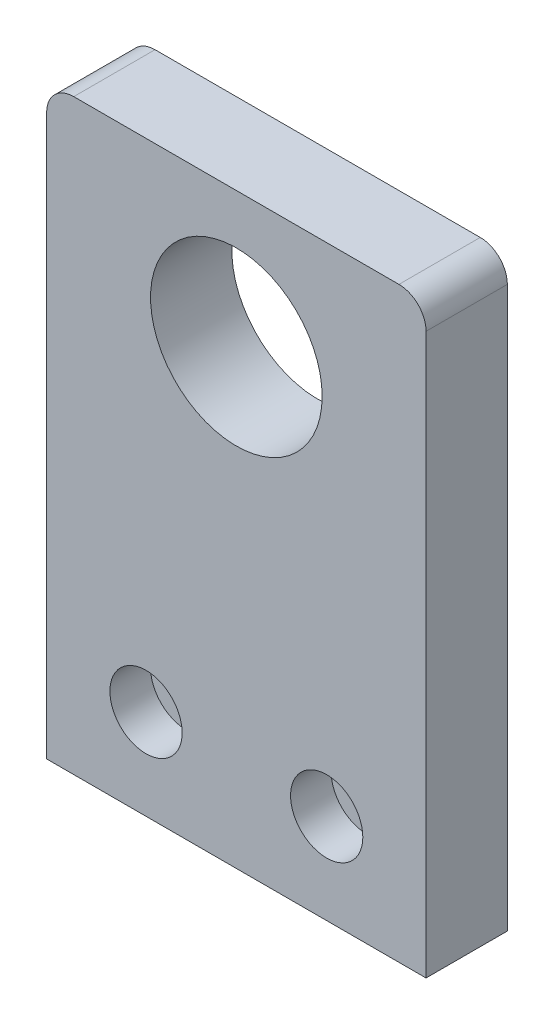
ISO-10303-21;
HEADER;
FILE_DESCRIPTION(('STEP AP214'),'2;1');
FILE_NAME('part.step','',(''),(''),'','','');
FILE_SCHEMA(('AUTOMOTIVE_DESIGN { 1 0 10303 214 1 1 1 1 }'));
ENDSEC;
DATA;
#1=APPLICATION_CONTEXT('core data for automotive mechanical design processes');
#2=APPLICATION_PROTOCOL_DEFINITION('international standard','automotive_design',2000,#1);
#3=PRODUCT_CONTEXT('',#1,'mechanical');
#4=PRODUCT('Part','Part','',(#3));
#5=PRODUCT_RELATED_PRODUCT_CATEGORY('part','',(#4));
#6=PRODUCT_DEFINITION_FORMATION('','',#4);
#7=PRODUCT_DEFINITION_CONTEXT('part definition',#1,'design');
#8=PRODUCT_DEFINITION('design','',#6,#7);
#9=PRODUCT_DEFINITION_SHAPE('','',#8);
#10=(LENGTH_UNIT() NAMED_UNIT(*) SI_UNIT(.MILLI.,.METRE.));
#11=(NAMED_UNIT(*) PLANE_ANGLE_UNIT() SI_UNIT($,.RADIAN.));
#12=(NAMED_UNIT(*) SI_UNIT($,.STERADIAN.) SOLID_ANGLE_UNIT());
#13=UNCERTAINTY_MEASURE_WITH_UNIT(LENGTH_MEASURE(1.E-05),#10,'distance_accuracy_value','');
#14=(GEOMETRIC_REPRESENTATION_CONTEXT(3) GLOBAL_UNCERTAINTY_ASSIGNED_CONTEXT((#13)) GLOBAL_UNIT_ASSIGNED_CONTEXT((#10,
#11,#12)) REPRESENTATION_CONTEXT('',''));
#15=CARTESIAN_POINT('',(0.,0.,0.));
#16=DIRECTION('',(0.,0.,1.));
#17=DIRECTION('',(1.,0.,0.));
#18=AXIS2_PLACEMENT_3D('',#15,#16,#17);
#19=CARTESIAN_POINT('',(10.,-22.5,9.));
#20=DIRECTION('',(0.,0.,-1.));
#21=DIRECTION('',(-1.,0.,0.));
#22=AXIS2_PLACEMENT_3D('',#19,#20,#21);
#23=CYLINDRICAL_SURFACE('',#22,2.);
#24=CARTESIAN_POINT('',(10.,-22.5,0.));
#25=DIRECTION('',(0.,0.,1.));
#26=DIRECTION('',(1.,0.,0.));
#27=AXIS2_PLACEMENT_3D('',#24,#25,#26);
#28=CIRCLE('',#27,2.);
#29=CARTESIAN_POINT('',(12.,-22.5,0.));
#30=VERTEX_POINT('',#29);
#31=EDGE_CURVE('E144',#30,#30,#28,.T.);
#32=ORIENTED_EDGE('',*,*,#31,.F.);
#33=EDGE_LOOP('',(#32));
#34=FACE_BOUND('',#33,.T.);
#35=CARTESIAN_POINT('',(10.,-22.5,4.5));
#36=DIRECTION('',(0.,0.,1.));
#37=DIRECTION('',(1.,0.,0.));
#38=AXIS2_PLACEMENT_3D('',#35,#36,#37);
#39=CIRCLE('',#38,2.);
#40=CARTESIAN_POINT('',(12.,-22.5,4.5));
#41=VERTEX_POINT('',#40);
#42=EDGE_CURVE('E37',#41,#41,#39,.T.);
#43=ORIENTED_EDGE('',*,*,#42,.T.);
#44=EDGE_LOOP('',(#43));
#45=FACE_BOUND('',#44,.T.);
#46=ADVANCED_FACE('F33',(#34,#45),#23,.F.);
#47=CARTESIAN_POINT('',(-9.99999999999999,-22.5,9.));
#48=DIRECTION('',(0.,0.,-1.));
#49=DIRECTION('',(-1.,0.,0.));
#50=AXIS2_PLACEMENT_3D('',#47,#48,#49);
#51=CYLINDRICAL_SURFACE('',#50,2.);
#52=CARTESIAN_POINT('',(-9.99999999999999,-22.5,0.));
#53=DIRECTION('',(0.,0.,1.));
#54=DIRECTION('',(1.,0.,0.));
#55=AXIS2_PLACEMENT_3D('',#52,#53,#54);
#56=CIRCLE('',#55,2.);
#57=CARTESIAN_POINT('',(-7.99999999999999,-22.5,0.));
#58=VERTEX_POINT('',#57);
#59=EDGE_CURVE('E139',#58,#58,#56,.T.);
#60=ORIENTED_EDGE('',*,*,#59,.F.);
#61=EDGE_LOOP('',(#60));
#62=FACE_BOUND('',#61,.T.);
#63=CARTESIAN_POINT('',(-9.99999999999999,-22.5,4.5));
#64=DIRECTION('',(0.,0.,1.));
#65=DIRECTION('',(1.,0.,0.));
#66=AXIS2_PLACEMENT_3D('',#63,#64,#65);
#67=CIRCLE('',#66,2.);
#68=CARTESIAN_POINT('',(-7.99999999999999,-22.5,4.5));
#69=VERTEX_POINT('',#68);
#70=EDGE_CURVE('E137',#69,#69,#67,.T.);
#71=ORIENTED_EDGE('',*,*,#70,.T.);
#72=EDGE_LOOP('',(#71));
#73=FACE_BOUND('',#72,.T.);
#74=ADVANCED_FACE('F190',(#62,#73),#51,.F.);
#75=CARTESIAN_POINT('',(-18.,29.5,9.));
#76=DIRECTION('',(0.,0.,1.));
#77=DIRECTION('',(1.,0.,0.));
#78=AXIS2_PLACEMENT_3D('',#75,#76,#77);
#79=PLANE('',#78);
#80=CARTESIAN_POINT('',(10.,-22.5,9.));
#81=DIRECTION('',(0.,0.,1.));
#82=DIRECTION('',(1.,0.,0.));
#83=AXIS2_PLACEMENT_3D('',#80,#81,#82);
#84=CIRCLE('',#83,4.);
#85=CARTESIAN_POINT('',(14.,-22.5,9.));
#86=VERTEX_POINT('',#85);
#87=EDGE_CURVE('E154',#86,#86,#84,.T.);
#88=ORIENTED_EDGE('',*,*,#87,.F.);
#89=EDGE_LOOP('',(#88));
#90=FACE_BOUND('',#89,.T.);
#91=CARTESIAN_POINT('',(-9.99999999999999,-22.5,9.));
#92=DIRECTION('',(0.,0.,1.));
#93=DIRECTION('',(1.,0.,0.));
#94=AXIS2_PLACEMENT_3D('',#91,#92,#93);
#95=CIRCLE('',#94,4.);
#96=CARTESIAN_POINT('',(-5.99999999999999,-22.5,9.));
#97=VERTEX_POINT('',#96);
#98=EDGE_CURVE('E147',#97,#97,#95,.T.);
#99=ORIENTED_EDGE('',*,*,#98,.F.);
#100=EDGE_LOOP('',(#99));
#101=FACE_BOUND('',#100,.T.);
#102=DIRECTION('',(0.,1.,0.));
#103=VECTOR('',#102,1.);
#104=CARTESIAN_POINT('',(21.,29.5,9.));
#105=LINE('',#104,#103);
#106=CARTESIAN_POINT('',(21.,-32.5,9.));
#107=VERTEX_POINT('',#106);
#108=CARTESIAN_POINT('',(21.,29.5,9.));
#109=VERTEX_POINT('',#108);
#110=EDGE_CURVE('E132',#107,#109,#105,.T.);
#111=ORIENTED_EDGE('',*,*,#110,.T.);
#112=CARTESIAN_POINT('',(18.,29.5,9.));
#113=DIRECTION('',(0.,0.,1.));
#114=DIRECTION('',(-1.,0.,0.));
#115=AXIS2_PLACEMENT_3D('',#112,#113,#114);
#116=CIRCLE('',#115,3.);
#117=CARTESIAN_POINT('',(18.,32.5,9.));
#118=VERTEX_POINT('',#117);
#119=EDGE_CURVE('E89',#109,#118,#116,.T.);
#120=ORIENTED_EDGE('',*,*,#119,.T.);
#121=DIRECTION('',(-1.,0.,0.));
#122=VECTOR('',#121,1.);
#123=CARTESIAN_POINT('',(-18.,32.5,9.));
#124=LINE('',#123,#122);
#125=CARTESIAN_POINT('',(-18.,32.5,9.));
#126=VERTEX_POINT('',#125);
#127=EDGE_CURVE('E103',#118,#126,#124,.T.);
#128=ORIENTED_EDGE('',*,*,#127,.T.);
#129=CARTESIAN_POINT('',(-18.,29.5,9.));
#130=DIRECTION('',(0.,0.,1.));
#131=DIRECTION('',(1.,0.,0.));
#132=AXIS2_PLACEMENT_3D('',#129,#130,#131);
#133=CIRCLE('',#132,3.);
#134=CARTESIAN_POINT('',(-21.,29.5,9.));
#135=VERTEX_POINT('',#134);
#136=EDGE_CURVE('E96',#126,#135,#133,.T.);
#137=ORIENTED_EDGE('',*,*,#136,.T.);
#138=DIRECTION('',(0.,-1.,0.));
#139=VECTOR('',#138,1.);
#140=CARTESIAN_POINT('',(-21.,29.5,9.));
#141=LINE('',#140,#139);
#142=CARTESIAN_POINT('',(-21.,-32.5,9.));
#143=VERTEX_POINT('',#142);
#144=EDGE_CURVE('E101',#135,#143,#141,.T.);
#145=ORIENTED_EDGE('',*,*,#144,.T.);
#146=DIRECTION('',(1.,0.,0.));
#147=VECTOR('',#146,1.);
#148=CARTESIAN_POINT('',(-21.,-32.5,9.));
#149=LINE('',#148,#147);
#150=EDGE_CURVE('E52',#143,#107,#149,.T.);
#151=ORIENTED_EDGE('',*,*,#150,.T.);
#152=EDGE_LOOP('',(#111,#120,#128,#137,#145,#151));
#153=FACE_BOUND('',#152,.T.);
#154=CARTESIAN_POINT('',(0.,17.5,9.));
#155=DIRECTION('',(0.,0.,1.));
#156=DIRECTION('',(1.,0.,0.));
#157=AXIS2_PLACEMENT_3D('',#154,#155,#156);
#158=CIRCLE('',#157,9.5);
#159=CARTESIAN_POINT('',(9.5,17.5,9.));
#160=VERTEX_POINT('',#159);
#161=EDGE_CURVE('E125',#160,#160,#158,.T.);
#162=ORIENTED_EDGE('',*,*,#161,.F.);
#163=EDGE_LOOP('',(#162));
#164=FACE_BOUND('',#163,.T.);
#165=ADVANCED_FACE('F98',(#90,#101,#153,#164),#79,.T.);
#166=CARTESIAN_POINT('',(-18.,29.5,0.));
#167=DIRECTION('',(0.,0.,1.));
#168=DIRECTION('',(1.,0.,0.));
#169=AXIS2_PLACEMENT_3D('',#166,#167,#168);
#170=PLANE('',#169);
#171=DIRECTION('',(0.,1.,0.));
#172=VECTOR('',#171,1.);
#173=CARTESIAN_POINT('',(21.,29.5,0.));
#174=LINE('',#173,#172);
#175=CARTESIAN_POINT('',(21.,-32.5,0.));
#176=VERTEX_POINT('',#175);
#177=CARTESIAN_POINT('',(21.,29.5,0.));
#178=VERTEX_POINT('',#177);
#179=EDGE_CURVE('E121',#176,#178,#174,.T.);
#180=ORIENTED_EDGE('',*,*,#179,.F.);
#181=DIRECTION('',(1.,0.,0.));
#182=VECTOR('',#181,1.);
#183=CARTESIAN_POINT('',(-21.,-32.5,0.));
#184=LINE('',#183,#182);
#185=CARTESIAN_POINT('',(-21.,-32.5,0.));
#186=VERTEX_POINT('',#185);
#187=EDGE_CURVE('E81',#186,#176,#184,.T.);
#188=ORIENTED_EDGE('',*,*,#187,.F.);
#189=DIRECTION('',(0.,-1.,0.));
#190=VECTOR('',#189,1.);
#191=CARTESIAN_POINT('',(-21.,29.5,0.));
#192=LINE('',#191,#190);
#193=CARTESIAN_POINT('',(-21.,29.5,0.));
#194=VERTEX_POINT('',#193);
#195=EDGE_CURVE('E75',#194,#186,#192,.T.);
#196=ORIENTED_EDGE('',*,*,#195,.F.);
#197=CARTESIAN_POINT('',(-18.,29.5,0.));
#198=DIRECTION('',(0.,0.,1.));
#199=DIRECTION('',(1.,0.,0.));
#200=AXIS2_PLACEMENT_3D('',#197,#198,#199);
#201=CIRCLE('',#200,3.);
#202=CARTESIAN_POINT('',(-18.,32.5,0.));
#203=VERTEX_POINT('',#202);
#204=EDGE_CURVE('E111',#203,#194,#201,.T.);
#205=ORIENTED_EDGE('',*,*,#204,.F.);
#206=DIRECTION('',(-1.,0.,0.));
#207=VECTOR('',#206,1.);
#208=CARTESIAN_POINT('',(-18.,32.5,0.));
#209=LINE('',#208,#207);
#210=CARTESIAN_POINT('',(18.,32.5,0.));
#211=VERTEX_POINT('',#210);
#212=EDGE_CURVE('E127',#211,#203,#209,.T.);
#213=ORIENTED_EDGE('',*,*,#212,.F.);
#214=CARTESIAN_POINT('',(18.,29.5,0.));
#215=DIRECTION('',(0.,0.,1.));
#216=DIRECTION('',(-1.,0.,0.));
#217=AXIS2_PLACEMENT_3D('',#214,#215,#216);
#218=CIRCLE('',#217,3.);
#219=EDGE_CURVE('E124',#178,#211,#218,.T.);
#220=ORIENTED_EDGE('',*,*,#219,.F.);
#221=EDGE_LOOP('',(#180,#188,#196,#205,#213,#220));
#222=FACE_BOUND('',#221,.T.);
#223=CARTESIAN_POINT('',(0.,17.5,0.));
#224=DIRECTION('',(0.,0.,1.));
#225=DIRECTION('',(1.,0.,0.));
#226=AXIS2_PLACEMENT_3D('',#223,#224,#225);
#227=CIRCLE('',#226,9.5);
#228=CARTESIAN_POINT('',(9.5,17.5,0.));
#229=VERTEX_POINT('',#228);
#230=EDGE_CURVE('E159',#229,#229,#227,.T.);
#231=ORIENTED_EDGE('',*,*,#230,.T.);
#232=EDGE_LOOP('',(#231));
#233=FACE_BOUND('',#232,.T.);
#234=ORIENTED_EDGE('',*,*,#31,.T.);
#235=EDGE_LOOP('',(#234));
#236=FACE_BOUND('',#235,.T.);
#237=ORIENTED_EDGE('',*,*,#59,.T.);
#238=EDGE_LOOP('',(#237));
#239=FACE_BOUND('',#238,.T.);
#240=ADVANCED_FACE('F173',(#222,#233,#236,#239),#170,.F.);
#241=CARTESIAN_POINT('',(21.,29.5,9.));
#242=DIRECTION('',(-1.,0.,0.));
#243=DIRECTION('',(0.,-1.,0.));
#244=AXIS2_PLACEMENT_3D('',#241,#242,#243);
#245=PLANE('',#244);
#246=ORIENTED_EDGE('',*,*,#179,.T.);
#247=DIRECTION('',(0.,0.,-1.));
#248=VECTOR('',#247,1.);
#249=CARTESIAN_POINT('',(21.,29.5,9.));
#250=LINE('',#249,#248);
#251=EDGE_CURVE('E11',#109,#178,#250,.T.);
#252=ORIENTED_EDGE('',*,*,#251,.F.);
#253=ORIENTED_EDGE('',*,*,#110,.F.);
#254=DIRECTION('',(0.,0.,-1.));
#255=VECTOR('',#254,1.);
#256=CARTESIAN_POINT('',(21.,-32.5,9.));
#257=LINE('',#256,#255);
#258=EDGE_CURVE('E117',#107,#176,#257,.T.);
#259=ORIENTED_EDGE('',*,*,#258,.T.);
#260=EDGE_LOOP('',(#246,#252,#253,#259));
#261=FACE_BOUND('',#260,.T.);
#262=ADVANCED_FACE('F35',(#261),#245,.F.);
#263=CARTESIAN_POINT('',(18.,29.5,9.));
#264=DIRECTION('',(0.,0.,-1.));
#265=DIRECTION('',(-1.,0.,0.));
#266=AXIS2_PLACEMENT_3D('',#263,#264,#265);
#267=CYLINDRICAL_SURFACE('',#266,3.);
#268=ORIENTED_EDGE('',*,*,#219,.T.);
#269=DIRECTION('',(0.,0.,-1.));
#270=VECTOR('',#269,1.);
#271=CARTESIAN_POINT('',(18.,32.5,9.));
#272=LINE('',#271,#270);
#273=EDGE_CURVE('E43',#118,#211,#272,.T.);
#274=ORIENTED_EDGE('',*,*,#273,.F.);
#275=ORIENTED_EDGE('',*,*,#119,.F.);
#276=ORIENTED_EDGE('',*,*,#251,.T.);
#277=EDGE_LOOP('',(#268,#274,#275,#276));
#278=FACE_BOUND('',#277,.T.);
#279=ADVANCED_FACE('F167',(#278),#267,.T.);
#280=CARTESIAN_POINT('',(-18.,32.5,9.));
#281=DIRECTION('',(0.,-1.,0.));
#282=DIRECTION('',(0.,0.,-1.));
#283=AXIS2_PLACEMENT_3D('',#280,#281,#282);
#284=PLANE('',#283);
#285=ORIENTED_EDGE('',*,*,#212,.T.);
#286=DIRECTION('',(0.,0.,-1.));
#287=VECTOR('',#286,1.);
#288=CARTESIAN_POINT('',(-18.,32.5,9.));
#289=LINE('',#288,#287);
#290=EDGE_CURVE('E112',#126,#203,#289,.T.);
#291=ORIENTED_EDGE('',*,*,#290,.F.);
#292=ORIENTED_EDGE('',*,*,#127,.F.);
#293=ORIENTED_EDGE('',*,*,#273,.T.);
#294=EDGE_LOOP('',(#285,#291,#292,#293));
#295=FACE_BOUND('',#294,.T.);
#296=ADVANCED_FACE('F170',(#295),#284,.F.);
#297=CARTESIAN_POINT('',(-18.,29.5,9.));
#298=DIRECTION('',(0.,0.,-1.));
#299=DIRECTION('',(-1.,0.,0.));
#300=AXIS2_PLACEMENT_3D('',#297,#298,#299);
#301=CYLINDRICAL_SURFACE('',#300,3.);
#302=ORIENTED_EDGE('',*,*,#204,.T.);
#303=DIRECTION('',(0.,0.,-1.));
#304=VECTOR('',#303,1.);
#305=CARTESIAN_POINT('',(-21.,29.5,9.));
#306=LINE('',#305,#304);
#307=EDGE_CURVE('E108',#135,#194,#306,.T.);
#308=ORIENTED_EDGE('',*,*,#307,.F.);
#309=ORIENTED_EDGE('',*,*,#136,.F.);
#310=ORIENTED_EDGE('',*,*,#290,.T.);
#311=EDGE_LOOP('',(#302,#308,#309,#310));
#312=FACE_BOUND('',#311,.T.);
#313=ADVANCED_FACE('F109',(#312),#301,.T.);
#314=CARTESIAN_POINT('',(-21.,29.5,9.));
#315=DIRECTION('',(1.,0.,0.));
#316=DIRECTION('',(0.,1.,0.));
#317=AXIS2_PLACEMENT_3D('',#314,#315,#316);
#318=PLANE('',#317);
#319=ORIENTED_EDGE('',*,*,#195,.T.);
#320=DIRECTION('',(0.,0.,-1.));
#321=VECTOR('',#320,1.);
#322=CARTESIAN_POINT('',(-21.,-32.5,9.));
#323=LINE('',#322,#321);
#324=EDGE_CURVE('E113',#143,#186,#323,.T.);
#325=ORIENTED_EDGE('',*,*,#324,.F.);
#326=ORIENTED_EDGE('',*,*,#144,.F.);
#327=ORIENTED_EDGE('',*,*,#307,.T.);
#328=EDGE_LOOP('',(#319,#325,#326,#327));
#329=FACE_BOUND('',#328,.T.);
#330=ADVANCED_FACE('F115',(#329),#318,.F.);
#331=CARTESIAN_POINT('',(-21.,-32.5,9.));
#332=DIRECTION('',(0.,1.,0.));
#333=DIRECTION('',(0.,0.,1.));
#334=AXIS2_PLACEMENT_3D('',#331,#332,#333);
#335=PLANE('',#334);
#336=ORIENTED_EDGE('',*,*,#187,.T.);
#337=ORIENTED_EDGE('',*,*,#258,.F.);
#338=ORIENTED_EDGE('',*,*,#150,.F.);
#339=ORIENTED_EDGE('',*,*,#324,.T.);
#340=EDGE_LOOP('',(#336,#337,#338,#339));
#341=FACE_BOUND('',#340,.T.);
#342=ADVANCED_FACE('F176',(#341),#335,.F.);
#343=CARTESIAN_POINT('',(0.,17.5,9.));
#344=DIRECTION('',(0.,0.,-1.));
#345=DIRECTION('',(-1.,0.,0.));
#346=AXIS2_PLACEMENT_3D('',#343,#344,#345);
#347=CYLINDRICAL_SURFACE('',#346,9.5);
#348=ORIENTED_EDGE('',*,*,#161,.T.);
#349=EDGE_LOOP('',(#348));
#350=FACE_BOUND('',#349,.T.);
#351=ORIENTED_EDGE('',*,*,#230,.F.);
#352=EDGE_LOOP('',(#351));
#353=FACE_BOUND('',#352,.T.);
#354=ADVANCED_FACE('F178',(#350,#353),#347,.F.);
#355=CARTESIAN_POINT('',(-9.99999999999999,-22.5,4.5));
#356=DIRECTION('',(0.,0.,1.));
#357=DIRECTION('',(1.,0.,0.));
#358=AXIS2_PLACEMENT_3D('',#355,#356,#357);
#359=CYLINDRICAL_SURFACE('',#358,4.);
#360=CARTESIAN_POINT('',(-9.99999999999999,-22.5,4.5));
#361=DIRECTION('',(0.,0.,1.));
#362=DIRECTION('',(1.,0.,0.));
#363=AXIS2_PLACEMENT_3D('',#360,#361,#362);
#364=CIRCLE('',#363,4.);
#365=CARTESIAN_POINT('',(-5.99999999999999,-22.5,4.5));
#366=VERTEX_POINT('',#365);
#367=EDGE_CURVE('E140',#366,#366,#364,.T.);
#368=ORIENTED_EDGE('',*,*,#367,.F.);
#369=EDGE_LOOP('',(#368));
#370=FACE_BOUND('',#369,.T.);
#371=ORIENTED_EDGE('',*,*,#98,.T.);
#372=EDGE_LOOP('',(#371));
#373=FACE_BOUND('',#372,.T.);
#374=ADVANCED_FACE('F184',(#370,#373),#359,.F.);
#375=CARTESIAN_POINT('',(-9.99999999999999,-22.5,4.5));
#376=DIRECTION('',(0.,0.,1.));
#377=DIRECTION('',(1.,0.,0.));
#378=AXIS2_PLACEMENT_3D('',#375,#376,#377);
#379=PLANE('',#378);
#380=ORIENTED_EDGE('',*,*,#70,.F.);
#381=EDGE_LOOP('',(#380));
#382=FACE_BOUND('',#381,.T.);
#383=ORIENTED_EDGE('',*,*,#367,.T.);
#384=EDGE_LOOP('',(#383));
#385=FACE_BOUND('',#384,.T.);
#386=ADVANCED_FACE('F261',(#382,#385),#379,.T.);
#387=CARTESIAN_POINT('',(10.,-22.5,4.5));
#388=DIRECTION('',(0.,0.,1.));
#389=DIRECTION('',(1.,0.,0.));
#390=AXIS2_PLACEMENT_3D('',#387,#388,#389);
#391=CYLINDRICAL_SURFACE('',#390,4.);
#392=CARTESIAN_POINT('',(10.,-22.5,4.5));
#393=DIRECTION('',(0.,0.,1.));
#394=DIRECTION('',(1.,0.,0.));
#395=AXIS2_PLACEMENT_3D('',#392,#393,#394);
#396=CIRCLE('',#395,4.);
#397=CARTESIAN_POINT('',(14.,-22.5,4.5));
#398=VERTEX_POINT('',#397);
#399=EDGE_CURVE('E299',#398,#398,#396,.T.);
#400=ORIENTED_EDGE('',*,*,#399,.F.);
#401=EDGE_LOOP('',(#400));
#402=FACE_BOUND('',#401,.T.);
#403=ORIENTED_EDGE('',*,*,#87,.T.);
#404=EDGE_LOOP('',(#403));
#405=FACE_BOUND('',#404,.T.);
#406=ADVANCED_FACE('F270',(#402,#405),#391,.F.);
#407=CARTESIAN_POINT('',(10.,-22.5,4.5));
#408=DIRECTION('',(0.,0.,1.));
#409=DIRECTION('',(1.,0.,0.));
#410=AXIS2_PLACEMENT_3D('',#407,#408,#409);
#411=PLANE('',#410);
#412=ORIENTED_EDGE('',*,*,#42,.F.);
#413=EDGE_LOOP('',(#412));
#414=FACE_BOUND('',#413,.T.);
#415=ORIENTED_EDGE('',*,*,#399,.T.);
#416=EDGE_LOOP('',(#415));
#417=FACE_BOUND('',#416,.T.);
#418=ADVANCED_FACE('F280',(#414,#417),#411,.T.);
#419=CLOSED_SHELL('',(#46,#74,#165,#240,#262,#279,#296,#313,#330,#342,#354,#374,#386,#406,#418));
#420=MANIFOLD_SOLID_BREP('B2',#419);
#421=ADVANCED_BREP_SHAPE_REPRESENTATION('',(#18,#420),#14);
#422=SHAPE_DEFINITION_REPRESENTATION(#9,#421);
ENDSEC;
END-ISO-10303-21;
